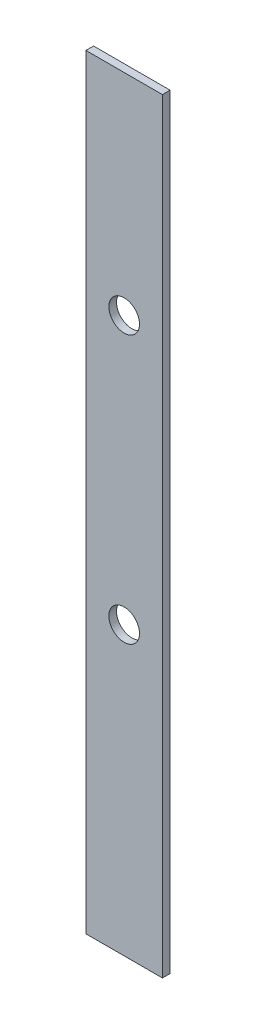
ISO-10303-21;
HEADER;
FILE_DESCRIPTION(('STEP AP214'),'2;1');
FILE_NAME('part.step','',(''),(''),'','','');
FILE_SCHEMA(('AUTOMOTIVE_DESIGN { 1 0 10303 214 1 1 1 1 }'));
ENDSEC;
DATA;
#1=APPLICATION_CONTEXT('core data for automotive mechanical design processes');
#2=APPLICATION_PROTOCOL_DEFINITION('international standard','automotive_design',2000,#1);
#3=PRODUCT_CONTEXT('',#1,'mechanical');
#4=PRODUCT('Part','Part','',(#3));
#5=PRODUCT_RELATED_PRODUCT_CATEGORY('part','',(#4));
#6=PRODUCT_DEFINITION_FORMATION('','',#4);
#7=PRODUCT_DEFINITION_CONTEXT('part definition',#1,'design');
#8=PRODUCT_DEFINITION('design','',#6,#7);
#9=PRODUCT_DEFINITION_SHAPE('','',#8);
#10=(LENGTH_UNIT() NAMED_UNIT(*) SI_UNIT(.MILLI.,.METRE.));
#11=(NAMED_UNIT(*) PLANE_ANGLE_UNIT() SI_UNIT($,.RADIAN.));
#12=(NAMED_UNIT(*) SI_UNIT($,.STERADIAN.) SOLID_ANGLE_UNIT());
#13=UNCERTAINTY_MEASURE_WITH_UNIT(LENGTH_MEASURE(1.E-05),#10,'distance_accuracy_value','');
#14=(GEOMETRIC_REPRESENTATION_CONTEXT(3) GLOBAL_UNCERTAINTY_ASSIGNED_CONTEXT((#13)) GLOBAL_UNIT_ASSIGNED_CONTEXT((#10,
#11,#12)) REPRESENTATION_CONTEXT('',''));
#15=CARTESIAN_POINT('',(0.,0.,0.));
#16=DIRECTION('',(0.,0.,1.));
#17=DIRECTION('',(1.,0.,0.));
#18=AXIS2_PLACEMENT_3D('',#15,#16,#17);
#19=CARTESIAN_POINT('',(-20.,200.,4.));
#20=DIRECTION('',(0.,1.,0.));
#21=DIRECTION('',(0.,0.,1.));
#22=AXIS2_PLACEMENT_3D('',#19,#20,#21);
#23=PLANE('',#22);
#24=DIRECTION('',(1.,0.,0.));
#25=VECTOR('',#24,1.);
#26=CARTESIAN_POINT('',(-20.,200.,0.));
#27=LINE('',#26,#25);
#28=CARTESIAN_POINT('',(-20.,200.,0.));
#29=VERTEX_POINT('',#28);
#30=CARTESIAN_POINT('',(20.,200.,0.));
#31=VERTEX_POINT('',#30);
#32=EDGE_CURVE('E87',#29,#31,#27,.T.);
#33=ORIENTED_EDGE('',*,*,#32,.F.);
#34=DIRECTION('',(0.,0.,-1.));
#35=VECTOR('',#34,1.);
#36=CARTESIAN_POINT('',(-20.,200.,4.));
#37=LINE('',#36,#35);
#38=CARTESIAN_POINT('',(-20.,200.,4.));
#39=VERTEX_POINT('',#38);
#40=EDGE_CURVE('E45',#39,#29,#37,.T.);
#41=ORIENTED_EDGE('',*,*,#40,.F.);
#42=DIRECTION('',(1.,0.,0.));
#43=VECTOR('',#42,1.);
#44=CARTESIAN_POINT('',(-20.,200.,4.));
#45=LINE('',#44,#43);
#46=CARTESIAN_POINT('',(20.,200.,4.));
#47=VERTEX_POINT('',#46);
#48=EDGE_CURVE('E86',#39,#47,#45,.T.);
#49=ORIENTED_EDGE('',*,*,#48,.T.);
#50=DIRECTION('',(0.,0.,-1.));
#51=VECTOR('',#50,1.);
#52=CARTESIAN_POINT('',(20.,200.,4.));
#53=LINE('',#52,#51);
#54=EDGE_CURVE('E11',#47,#31,#53,.T.);
#55=ORIENTED_EDGE('',*,*,#54,.T.);
#56=EDGE_LOOP('',(#33,#41,#49,#55));
#57=FACE_BOUND('',#56,.T.);
#58=ADVANCED_FACE('F37',(#57),#23,.T.);
#59=CARTESIAN_POINT('',(-20.,-200.,4.));
#60=DIRECTION('',(-1.,0.,0.));
#61=DIRECTION('',(0.,0.,1.));
#62=AXIS2_PLACEMENT_3D('',#59,#60,#61);
#63=PLANE('',#62);
#64=DIRECTION('',(0.,1.,0.));
#65=VECTOR('',#64,1.);
#66=CARTESIAN_POINT('',(-20.,-200.,0.));
#67=LINE('',#66,#65);
#68=CARTESIAN_POINT('',(-20.,-200.,0.));
#69=VERTEX_POINT('',#68);
#70=EDGE_CURVE('E102',#69,#29,#67,.T.);
#71=ORIENTED_EDGE('',*,*,#70,.F.);
#72=DIRECTION('',(0.,0.,-1.));
#73=VECTOR('',#72,1.);
#74=CARTESIAN_POINT('',(-20.,-200.,4.));
#75=LINE('',#74,#73);
#76=CARTESIAN_POINT('',(-20.,-200.,4.));
#77=VERTEX_POINT('',#76);
#78=EDGE_CURVE('E71',#77,#69,#75,.T.);
#79=ORIENTED_EDGE('',*,*,#78,.F.);
#80=DIRECTION('',(0.,1.,0.));
#81=VECTOR('',#80,1.);
#82=CARTESIAN_POINT('',(-20.,140.,4.));
#83=LINE('',#82,#81);
#84=EDGE_CURVE('E92',#77,#39,#83,.T.);
#85=ORIENTED_EDGE('',*,*,#84,.T.);
#86=ORIENTED_EDGE('',*,*,#40,.T.);
#87=EDGE_LOOP('',(#71,#79,#85,#86));
#88=FACE_BOUND('',#87,.T.);
#89=ADVANCED_FACE('F94',(#88),#63,.T.);
#90=CARTESIAN_POINT('',(-20.,-200.,4.));
#91=DIRECTION('',(0.,1.,0.));
#92=DIRECTION('',(0.,0.,1.));
#93=AXIS2_PLACEMENT_3D('',#90,#91,#92);
#94=PLANE('',#93);
#95=DIRECTION('',(1.,0.,0.));
#96=VECTOR('',#95,1.);
#97=CARTESIAN_POINT('',(-20.,-200.,0.));
#98=LINE('',#97,#96);
#99=CARTESIAN_POINT('',(20.,-200.,0.));
#100=VERTEX_POINT('',#99);
#101=EDGE_CURVE('E105',#69,#100,#98,.T.);
#102=ORIENTED_EDGE('',*,*,#101,.T.);
#103=DIRECTION('',(0.,0.,-1.));
#104=VECTOR('',#103,1.);
#105=CARTESIAN_POINT('',(20.,-200.,4.));
#106=LINE('',#105,#104);
#107=CARTESIAN_POINT('',(20.,-200.,4.));
#108=VERTEX_POINT('',#107);
#109=EDGE_CURVE('E97',#108,#100,#106,.T.);
#110=ORIENTED_EDGE('',*,*,#109,.F.);
#111=DIRECTION('',(1.,0.,0.));
#112=VECTOR('',#111,1.);
#113=CARTESIAN_POINT('',(-20.,-200.,4.));
#114=LINE('',#113,#112);
#115=EDGE_CURVE('E95',#77,#108,#114,.T.);
#116=ORIENTED_EDGE('',*,*,#115,.F.);
#117=ORIENTED_EDGE('',*,*,#78,.T.);
#118=EDGE_LOOP('',(#102,#110,#116,#117));
#119=FACE_BOUND('',#118,.T.);
#120=ADVANCED_FACE('F111',(#119),#94,.F.);
#121=CARTESIAN_POINT('',(20.,140.,4.));
#122=DIRECTION('',(1.,0.,0.));
#123=DIRECTION('',(0.,1.,0.));
#124=AXIS2_PLACEMENT_3D('',#121,#122,#123);
#125=PLANE('',#124);
#126=DIRECTION('',(0.,-1.,0.));
#127=VECTOR('',#126,1.);
#128=CARTESIAN_POINT('',(20.,140.,0.));
#129=LINE('',#128,#127);
#130=EDGE_CURVE('E77',#31,#100,#129,.T.);
#131=ORIENTED_EDGE('',*,*,#130,.F.);
#132=ORIENTED_EDGE('',*,*,#54,.F.);
#133=DIRECTION('',(0.,1.,0.));
#134=VECTOR('',#133,1.);
#135=CARTESIAN_POINT('',(20.,140.,4.));
#136=LINE('',#135,#134);
#137=EDGE_CURVE('E53',#108,#47,#136,.T.);
#138=ORIENTED_EDGE('',*,*,#137,.F.);
#139=ORIENTED_EDGE('',*,*,#109,.T.);
#140=EDGE_LOOP('',(#131,#132,#138,#139));
#141=FACE_BOUND('',#140,.T.);
#142=ADVANCED_FACE('F110',(#141),#125,.T.);
#143=CARTESIAN_POINT('',(0.,0.,4.));
#144=DIRECTION('',(0.,0.,-1.));
#145=DIRECTION('',(-1.,0.,0.));
#146=AXIS2_PLACEMENT_3D('',#143,#144,#145);
#147=PLANE('',#146);
#148=CARTESIAN_POINT('',(0.,90.,4.));
#149=DIRECTION('',(0.,0.,-1.));
#150=DIRECTION('',(-1.,0.,0.));
#151=AXIS2_PLACEMENT_3D('',#148,#149,#150);
#152=CIRCLE('',#151,8.00000000000001);
#153=CARTESIAN_POINT('',(-8.00000000000005,90.,4.));
#154=VERTEX_POINT('',#153);
#155=EDGE_CURVE('E103',#154,#154,#152,.T.);
#156=ORIENTED_EDGE('',*,*,#155,.T.);
#157=EDGE_LOOP('',(#156));
#158=FACE_BOUND('',#157,.T.);
#159=CARTESIAN_POINT('',(0.,-50.,4.));
#160=DIRECTION('',(0.,0.,-1.));
#161=DIRECTION('',(-1.,0.,0.));
#162=AXIS2_PLACEMENT_3D('',#159,#160,#161);
#163=CIRCLE('',#162,8.);
#164=CARTESIAN_POINT('',(-8.00000000000002,-50.,4.));
#165=VERTEX_POINT('',#164);
#166=EDGE_CURVE('E174',#165,#165,#163,.T.);
#167=ORIENTED_EDGE('',*,*,#166,.T.);
#168=EDGE_LOOP('',(#167));
#169=FACE_BOUND('',#168,.T.);
#170=ORIENTED_EDGE('',*,*,#137,.T.);
#171=ORIENTED_EDGE('',*,*,#48,.F.);
#172=ORIENTED_EDGE('',*,*,#84,.F.);
#173=ORIENTED_EDGE('',*,*,#115,.T.);
#174=EDGE_LOOP('',(#170,#171,#172,#173));
#175=FACE_BOUND('',#174,.T.);
#176=ADVANCED_FACE('F91',(#158,#169,#175),#147,.F.);
#177=CARTESIAN_POINT('',(0.,0.,0.));
#178=DIRECTION('',(0.,0.,-1.));
#179=DIRECTION('',(-1.,0.,0.));
#180=AXIS2_PLACEMENT_3D('',#177,#178,#179);
#181=PLANE('',#180);
#182=CARTESIAN_POINT('',(0.,90.,0.));
#183=DIRECTION('',(0.,0.,-1.));
#184=DIRECTION('',(-1.,0.,0.));
#185=AXIS2_PLACEMENT_3D('',#182,#183,#184);
#186=CIRCLE('',#185,8.00000000000001);
#187=CARTESIAN_POINT('',(-8.00000000000005,90.,0.));
#188=VERTEX_POINT('',#187);
#189=EDGE_CURVE('E173',#188,#188,#186,.T.);
#190=ORIENTED_EDGE('',*,*,#189,.F.);
#191=EDGE_LOOP('',(#190));
#192=FACE_BOUND('',#191,.T.);
#193=CARTESIAN_POINT('',(0.,-50.,0.));
#194=DIRECTION('',(0.,0.,-1.));
#195=DIRECTION('',(-1.,0.,0.));
#196=AXIS2_PLACEMENT_3D('',#193,#194,#195);
#197=CIRCLE('',#196,8.);
#198=CARTESIAN_POINT('',(-8.00000000000002,-50.,0.));
#199=VERTEX_POINT('',#198);
#200=EDGE_CURVE('E178',#199,#199,#197,.T.);
#201=ORIENTED_EDGE('',*,*,#200,.F.);
#202=EDGE_LOOP('',(#201));
#203=FACE_BOUND('',#202,.T.);
#204=ORIENTED_EDGE('',*,*,#32,.T.);
#205=ORIENTED_EDGE('',*,*,#130,.T.);
#206=ORIENTED_EDGE('',*,*,#101,.F.);
#207=ORIENTED_EDGE('',*,*,#70,.T.);
#208=EDGE_LOOP('',(#204,#205,#206,#207));
#209=FACE_BOUND('',#208,.T.);
#210=ADVANCED_FACE('F112',(#192,#203,#209),#181,.T.);
#211=CARTESIAN_POINT('',(0.,-50.,4.));
#212=DIRECTION('',(0.,0.,-1.));
#213=DIRECTION('',(-1.,0.,0.));
#214=AXIS2_PLACEMENT_3D('',#211,#212,#213);
#215=CYLINDRICAL_SURFACE('',#214,8.);
#216=ORIENTED_EDGE('',*,*,#166,.F.);
#217=EDGE_LOOP('',(#216));
#218=FACE_BOUND('',#217,.T.);
#219=ORIENTED_EDGE('',*,*,#200,.T.);
#220=EDGE_LOOP('',(#219));
#221=FACE_BOUND('',#220,.T.);
#222=ADVANCED_FACE('F114',(#218,#221),#215,.F.);
#223=CARTESIAN_POINT('',(0.,90.,4.));
#224=DIRECTION('',(0.,0.,-1.));
#225=DIRECTION('',(-1.,0.,0.));
#226=AXIS2_PLACEMENT_3D('',#223,#224,#225);
#227=CYLINDRICAL_SURFACE('',#226,8.00000000000001);
#228=ORIENTED_EDGE('',*,*,#155,.F.);
#229=EDGE_LOOP('',(#228));
#230=FACE_BOUND('',#229,.T.);
#231=ORIENTED_EDGE('',*,*,#189,.T.);
#232=EDGE_LOOP('',(#231));
#233=FACE_BOUND('',#232,.T.);
#234=ADVANCED_FACE('F121',(#230,#233),#227,.F.);
#235=CLOSED_SHELL('',(#58,#89,#120,#142,#176,#210,#222,#234));
#236=MANIFOLD_SOLID_BREP('B2',#235);
#237=ADVANCED_BREP_SHAPE_REPRESENTATION('',(#18,#236),#14);
#238=SHAPE_DEFINITION_REPRESENTATION(#9,#237);
ENDSEC;
END-ISO-10303-21;
